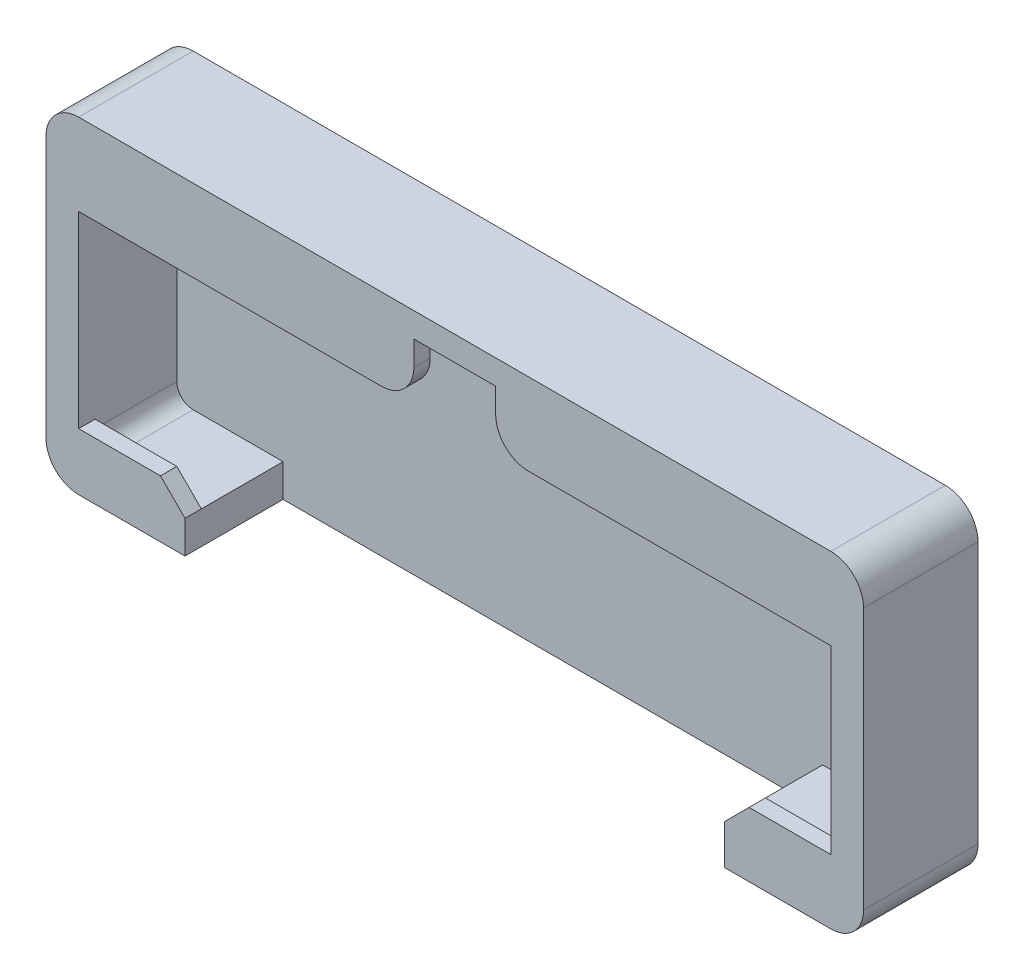
ISO-10303-21;
HEADER;
FILE_DESCRIPTION(('STEP AP214'),'2;1');
FILE_NAME('part.step','',(''),(''),'','','');
FILE_SCHEMA(('AUTOMOTIVE_DESIGN { 1 0 10303 214 1 1 1 1 }'));
ENDSEC;
DATA;
#1=APPLICATION_CONTEXT('core data for automotive mechanical design processes');
#2=APPLICATION_PROTOCOL_DEFINITION('international standard','automotive_design',2000,#1);
#3=PRODUCT_CONTEXT('',#1,'mechanical');
#4=PRODUCT('Part','Part','',(#3));
#5=PRODUCT_RELATED_PRODUCT_CATEGORY('part','',(#4));
#6=PRODUCT_DEFINITION_FORMATION('','',#4);
#7=PRODUCT_DEFINITION_CONTEXT('part definition',#1,'design');
#8=PRODUCT_DEFINITION('design','',#6,#7);
#9=PRODUCT_DEFINITION_SHAPE('','',#8);
#10=(LENGTH_UNIT() NAMED_UNIT(*) SI_UNIT(.MILLI.,.METRE.));
#11=(NAMED_UNIT(*) PLANE_ANGLE_UNIT() SI_UNIT($,.RADIAN.));
#12=(NAMED_UNIT(*) SI_UNIT($,.STERADIAN.) SOLID_ANGLE_UNIT());
#13=UNCERTAINTY_MEASURE_WITH_UNIT(LENGTH_MEASURE(1.E-05),#10,'distance_accuracy_value','');
#14=(GEOMETRIC_REPRESENTATION_CONTEXT(3) GLOBAL_UNCERTAINTY_ASSIGNED_CONTEXT((#13)) GLOBAL_UNIT_ASSIGNED_CONTEXT((#10,
#11,#12)) REPRESENTATION_CONTEXT('',''));
#15=CARTESIAN_POINT('',(0.,0.,0.));
#16=DIRECTION('',(0.,0.,1.));
#17=DIRECTION('',(1.,0.,0.));
#18=AXIS2_PLACEMENT_3D('',#15,#16,#17);
#19=CARTESIAN_POINT('',(0.,5.,0.));
#20=DIRECTION('',(0.,-1.,0.));
#21=DIRECTION('',(0.,0.,-1.));
#22=AXIS2_PLACEMENT_3D('',#19,#20,#21);
#23=PLANE('',#22);
#24=DIRECTION('',(-1.,0.,0.));
#25=VECTOR('',#24,1.);
#26=CARTESIAN_POINT('',(-23.,5.,7.));
#27=LINE('',#26,#25);
#28=CARTESIAN_POINT('',(23.,5.,7.));
#29=VERTEX_POINT('',#28);
#30=CARTESIAN_POINT('',(4.5,5.,7.));
#31=VERTEX_POINT('',#30);
#32=EDGE_CURVE('E339',#29,#31,#27,.T.);
#33=ORIENTED_EDGE('',*,*,#32,.T.);
#34=DIRECTION('',(0.,0.,1.));
#35=VECTOR('',#34,1.);
#36=CARTESIAN_POINT('',(4.5,5.,6.));
#37=LINE('',#36,#35);
#38=CARTESIAN_POINT('',(4.5,5.,6.));
#39=VERTEX_POINT('',#38);
#40=EDGE_CURVE('E11',#31,#39,#37,.F.);
#41=ORIENTED_EDGE('',*,*,#40,.T.);
#42=DIRECTION('',(1.,0.,0.));
#43=VECTOR('',#42,1.);
#44=CARTESIAN_POINT('',(-23.,5.,6.));
#45=LINE('',#44,#43);
#46=CARTESIAN_POINT('',(23.,5.,6.));
#47=VERTEX_POINT('',#46);
#48=EDGE_CURVE('E332',#39,#47,#45,.T.);
#49=ORIENTED_EDGE('',*,*,#48,.T.);
#50=DIRECTION('',(0.,0.,1.));
#51=VECTOR('',#50,1.);
#52=CARTESIAN_POINT('',(23.,5.,7.));
#53=LINE('',#52,#51);
#54=EDGE_CURVE('E336',#47,#29,#53,.T.);
#55=ORIENTED_EDGE('',*,*,#54,.T.);
#56=EDGE_LOOP('',(#33,#41,#49,#55));
#57=FACE_BOUND('',#56,.T.);
#58=ADVANCED_FACE('F33',(#57),#23,.T.);
#59=CARTESIAN_POINT('',(23.,9.,7.));
#60=DIRECTION('',(1.,0.,0.));
#61=DIRECTION('',(0.,0.,-1.));
#62=AXIS2_PLACEMENT_3D('',#59,#60,#61);
#63=PLANE('',#62);
#64=DIRECTION('',(0.,-1.,0.));
#65=VECTOR('',#64,1.);
#66=CARTESIAN_POINT('',(23.,9.,1.));
#67=LINE('',#66,#65);
#68=CARTESIAN_POINT('',(23.,8.,1.));
#69=VERTEX_POINT('',#68);
#70=CARTESIAN_POINT('',(23.,-6.56117908520792,1.));
#71=VERTEX_POINT('',#70);
#72=EDGE_CURVE('E354',#69,#71,#67,.T.);
#73=ORIENTED_EDGE('',*,*,#72,.T.);
#74=DIRECTION('',(0.,0.,-1.));
#75=VECTOR('',#74,1.);
#76=CARTESIAN_POINT('',(23.,-6.56117908520793,6.));
#77=LINE('',#76,#75);
#78=CARTESIAN_POINT('',(23.,-6.56117908520793,6.));
#79=VERTEX_POINT('',#78);
#80=EDGE_CURVE('E471',#71,#79,#77,.F.);
#81=ORIENTED_EDGE('',*,*,#80,.T.);
#82=DIRECTION('',(0.,-1.,0.));
#83=VECTOR('',#82,1.);
#84=CARTESIAN_POINT('',(23.,-6.06117908520793,6.));
#85=LINE('',#84,#83);
#86=CARTESIAN_POINT('',(23.,-6.06117908520793,6.));
#87=VERTEX_POINT('',#86);
#88=EDGE_CURVE('E286',#87,#79,#85,.T.);
#89=ORIENTED_EDGE('',*,*,#88,.F.);
#90=DIRECTION('',(0.,0.,-1.));
#91=VECTOR('',#90,1.);
#92=CARTESIAN_POINT('',(23.,-6.06117908520793,7.));
#93=LINE('',#92,#91);
#94=CARTESIAN_POINT('',(23.,-6.06117908520793,7.));
#95=VERTEX_POINT('',#94);
#96=EDGE_CURVE('E281',#95,#87,#93,.T.);
#97=ORIENTED_EDGE('',*,*,#96,.F.);
#98=DIRECTION('',(0.,-1.,0.));
#99=VECTOR('',#98,1.);
#100=CARTESIAN_POINT('',(23.,9.,7.));
#101=LINE('',#100,#99);
#102=EDGE_CURVE('E359',#29,#95,#101,.T.);
#103=ORIENTED_EDGE('',*,*,#102,.F.);
#104=ORIENTED_EDGE('',*,*,#54,.F.);
#105=DIRECTION('',(0.,1.,0.));
#106=VECTOR('',#105,1.);
#107=CARTESIAN_POINT('',(23.,5.,6.));
#108=LINE('',#107,#106);
#109=CARTESIAN_POINT('',(23.,8.,6.));
#110=VERTEX_POINT('',#109);
#111=EDGE_CURVE('E341',#47,#110,#108,.T.);
#112=ORIENTED_EDGE('',*,*,#111,.T.);
#113=DIRECTION('',(0.,0.,-1.));
#114=VECTOR('',#113,1.);
#115=CARTESIAN_POINT('',(23.,8.,1.));
#116=LINE('',#115,#114);
#117=EDGE_CURVE('E468',#110,#69,#116,.T.);
#118=ORIENTED_EDGE('',*,*,#117,.T.);
#119=EDGE_LOOP('',(#73,#81,#89,#97,#103,#104,#112,#118));
#120=FACE_BOUND('',#119,.T.);
#121=ADVANCED_FACE('F531',(#120),#63,.F.);
#122=CARTESIAN_POINT('',(23.,-7.56117908520793,7.));
#123=DIRECTION('',(0.,-1.,0.));
#124=DIRECTION('',(1.,0.,0.));
#125=AXIS2_PLACEMENT_3D('',#122,#123,#124);
#126=PLANE('',#125);
#127=DIRECTION('',(-1.,0.,0.));
#128=VECTOR('',#127,1.);
#129=CARTESIAN_POINT('',(16.5,-7.56117908520793,6.));
#130=LINE('',#129,#128);
#131=CARTESIAN_POINT('',(22.,-7.56117908520793,6.));
#132=VERTEX_POINT('',#131);
#133=CARTESIAN_POINT('',(16.5,-7.56117908520793,6.));
#134=VERTEX_POINT('',#133);
#135=EDGE_CURVE('E278',#132,#134,#130,.T.);
#136=ORIENTED_EDGE('',*,*,#135,.F.);
#137=DIRECTION('',(0.,0.,-1.));
#138=VECTOR('',#137,1.);
#139=CARTESIAN_POINT('',(22.,-7.56117908520793,1.));
#140=LINE('',#139,#138);
#141=CARTESIAN_POINT('',(22.,-7.56117908520793,1.));
#142=VERTEX_POINT('',#141);
#143=EDGE_CURVE('E465',#132,#142,#140,.T.);
#144=ORIENTED_EDGE('',*,*,#143,.T.);
#145=DIRECTION('',(-1.,0.,0.));
#146=VECTOR('',#145,1.);
#147=CARTESIAN_POINT('',(23.,-7.56117908520793,1.));
#148=LINE('',#147,#146);
#149=CARTESIAN_POINT('',(16.5,-7.56117908520793,1.));
#150=VERTEX_POINT('',#149);
#151=EDGE_CURVE('E303',#142,#150,#148,.T.);
#152=ORIENTED_EDGE('',*,*,#151,.T.);
#153=DIRECTION('',(0.,0.,-1.));
#154=VECTOR('',#153,1.);
#155=CARTESIAN_POINT('',(16.5,-7.56117908520793,7.));
#156=LINE('',#155,#154);
#157=EDGE_CURVE('E312',#134,#150,#156,.T.);
#158=ORIENTED_EDGE('',*,*,#157,.F.);
#159=EDGE_LOOP('',(#136,#144,#152,#158));
#160=FACE_BOUND('',#159,.T.);
#161=ADVANCED_FACE('F625',(#160),#126,.F.);
#162=CARTESIAN_POINT('',(-23.,9.,7.));
#163=DIRECTION('',(-1.,0.,0.));
#164=DIRECTION('',(0.,0.,1.));
#165=AXIS2_PLACEMENT_3D('',#162,#163,#164);
#166=PLANE('',#165);
#167=DIRECTION('',(0.,-1.,0.));
#168=VECTOR('',#167,1.);
#169=CARTESIAN_POINT('',(-23.,-6.5,6.));
#170=LINE('',#169,#168);
#171=CARTESIAN_POINT('',(-23.,-6.5,6.));
#172=VERTEX_POINT('',#171);
#173=CARTESIAN_POINT('',(-23.,-7.,6.));
#174=VERTEX_POINT('',#173);
#175=EDGE_CURVE('E298',#172,#174,#170,.T.);
#176=ORIENTED_EDGE('',*,*,#175,.T.);
#177=DIRECTION('',(0.,0.,-1.));
#178=VECTOR('',#177,1.);
#179=CARTESIAN_POINT('',(-23.,-7.,1.));
#180=LINE('',#179,#178);
#181=CARTESIAN_POINT('',(-23.,-7.,1.));
#182=VERTEX_POINT('',#181);
#183=EDGE_CURVE('E450',#174,#182,#180,.T.);
#184=ORIENTED_EDGE('',*,*,#183,.T.);
#185=DIRECTION('',(0.,1.,0.));
#186=VECTOR('',#185,1.);
#187=CARTESIAN_POINT('',(-23.,9.,1.));
#188=LINE('',#187,#186);
#189=CARTESIAN_POINT('',(-23.,8.,1.));
#190=VERTEX_POINT('',#189);
#191=EDGE_CURVE('E349',#182,#190,#188,.T.);
#192=ORIENTED_EDGE('',*,*,#191,.T.);
#193=DIRECTION('',(0.,0.,-1.));
#194=VECTOR('',#193,1.);
#195=CARTESIAN_POINT('',(-23.,8.,6.));
#196=LINE('',#195,#194);
#197=CARTESIAN_POINT('',(-23.,8.,6.));
#198=VERTEX_POINT('',#197);
#199=EDGE_CURVE('E448',#190,#198,#196,.F.);
#200=ORIENTED_EDGE('',*,*,#199,.T.);
#201=DIRECTION('',(0.,1.,0.));
#202=VECTOR('',#201,1.);
#203=CARTESIAN_POINT('',(-23.,5.,6.));
#204=LINE('',#203,#202);
#205=CARTESIAN_POINT('',(-23.,5.,6.));
#206=VERTEX_POINT('',#205);
#207=EDGE_CURVE('E346',#206,#198,#204,.T.);
#208=ORIENTED_EDGE('',*,*,#207,.F.);
#209=DIRECTION('',(0.,0.,-1.));
#210=VECTOR('',#209,1.);
#211=CARTESIAN_POINT('',(-23.,5.,7.));
#212=LINE('',#211,#210);
#213=CARTESIAN_POINT('',(-23.,5.,7.));
#214=VERTEX_POINT('',#213);
#215=EDGE_CURVE('E329',#214,#206,#212,.T.);
#216=ORIENTED_EDGE('',*,*,#215,.F.);
#217=DIRECTION('',(0.,1.,0.));
#218=VECTOR('',#217,1.);
#219=CARTESIAN_POINT('',(-23.,9.,7.));
#220=LINE('',#219,#218);
#221=CARTESIAN_POINT('',(-23.,-6.5,7.));
#222=VERTEX_POINT('',#221);
#223=EDGE_CURVE('E356',#222,#214,#220,.T.);
#224=ORIENTED_EDGE('',*,*,#223,.F.);
#225=DIRECTION('',(0.,0.,1.));
#226=VECTOR('',#225,1.);
#227=CARTESIAN_POINT('',(-23.,-6.5,7.));
#228=LINE('',#227,#226);
#229=EDGE_CURVE('E293',#172,#222,#228,.T.);
#230=ORIENTED_EDGE('',*,*,#229,.F.);
#231=EDGE_LOOP('',(#176,#184,#192,#200,#208,#216,#224,#230));
#232=FACE_BOUND('',#231,.T.);
#233=ADVANCED_FACE('F511',(#232),#166,.F.);
#234=CARTESIAN_POINT('',(-23.,-8.,7.));
#235=DIRECTION('',(0.,-1.,0.));
#236=DIRECTION('',(0.,0.,-1.));
#237=AXIS2_PLACEMENT_3D('',#234,#235,#236);
#238=PLANE('',#237);
#239=DIRECTION('',(-1.,0.,0.));
#240=VECTOR('',#239,1.);
#241=CARTESIAN_POINT('',(-23.,-8.,1.));
#242=LINE('',#241,#240);
#243=CARTESIAN_POINT('',(-16.5,-8.,1.));
#244=VERTEX_POINT('',#243);
#245=CARTESIAN_POINT('',(-22.,-8.,1.));
#246=VERTEX_POINT('',#245);
#247=EDGE_CURVE('E320',#244,#246,#242,.T.);
#248=ORIENTED_EDGE('',*,*,#247,.T.);
#249=DIRECTION('',(0.,0.,-1.));
#250=VECTOR('',#249,1.);
#251=CARTESIAN_POINT('',(-22.,-8.,6.));
#252=LINE('',#251,#250);
#253=CARTESIAN_POINT('',(-22.,-8.,6.));
#254=VERTEX_POINT('',#253);
#255=EDGE_CURVE('E461',#246,#254,#252,.F.);
#256=ORIENTED_EDGE('',*,*,#255,.T.);
#257=DIRECTION('',(-1.,0.,0.));
#258=VECTOR('',#257,1.);
#259=CARTESIAN_POINT('',(-16.5,-8.,6.));
#260=LINE('',#259,#258);
#261=CARTESIAN_POINT('',(-16.5,-8.,6.));
#262=VERTEX_POINT('',#261);
#263=EDGE_CURVE('E290',#262,#254,#260,.T.);
#264=ORIENTED_EDGE('',*,*,#263,.F.);
#265=DIRECTION('',(0.,0.,-1.));
#266=VECTOR('',#265,1.);
#267=CARTESIAN_POINT('',(-16.5,-8.,7.));
#268=LINE('',#267,#266);
#269=EDGE_CURVE('E319',#262,#244,#268,.T.);
#270=ORIENTED_EDGE('',*,*,#269,.T.);
#271=EDGE_LOOP('',(#248,#256,#264,#270));
#272=FACE_BOUND('',#271,.T.);
#273=ADVANCED_FACE('F643',(#272),#238,.F.);
#274=CARTESIAN_POINT('',(0.,0.,1.));
#275=DIRECTION('',(0.,0.,1.));
#276=DIRECTION('',(1.,0.,0.));
#277=AXIS2_PLACEMENT_3D('',#274,#275,#276);
#278=PLANE('',#277);
#279=ORIENTED_EDGE('',*,*,#191,.F.);
#280=CARTESIAN_POINT('',(-22.,-7.,1.));
#281=DIRECTION('',(0.,0.,1.));
#282=DIRECTION('',(1.,0.,0.));
#283=AXIS2_PLACEMENT_3D('',#280,#281,#282);
#284=CIRCLE('',#283,1.);
#285=EDGE_CURVE('E459',#182,#246,#284,.T.);
#286=ORIENTED_EDGE('',*,*,#285,.T.);
#287=ORIENTED_EDGE('',*,*,#247,.F.);
#288=DIRECTION('',(0.,1.,0.));
#289=VECTOR('',#288,1.);
#290=CARTESIAN_POINT('',(-16.5,-10.,1.));
#291=LINE('',#290,#289);
#292=CARTESIAN_POINT('',(-16.5,-10.,1.));
#293=VERTEX_POINT('',#292);
#294=EDGE_CURVE('E315',#293,#244,#291,.T.);
#295=ORIENTED_EDGE('',*,*,#294,.F.);
#296=DIRECTION('',(1.,0.,0.));
#297=VECTOR('',#296,1.);
#298=CARTESIAN_POINT('',(-25.,-10.,1.));
#299=LINE('',#298,#297);
#300=CARTESIAN_POINT('',(16.5,-10.,1.));
#301=VERTEX_POINT('',#300);
#302=EDGE_CURVE('E379',#293,#301,#299,.T.);
#303=ORIENTED_EDGE('',*,*,#302,.T.);
#304=DIRECTION('',(0.,-1.,0.));
#305=VECTOR('',#304,1.);
#306=CARTESIAN_POINT('',(16.5,-10.,1.));
#307=LINE('',#306,#305);
#308=EDGE_CURVE('E307',#150,#301,#307,.T.);
#309=ORIENTED_EDGE('',*,*,#308,.F.);
#310=ORIENTED_EDGE('',*,*,#151,.F.);
#311=CARTESIAN_POINT('',(22.,-6.56117908520793,1.));
#312=DIRECTION('',(0.,0.,1.));
#313=DIRECTION('',(1.,0.,0.));
#314=AXIS2_PLACEMENT_3D('',#311,#312,#313);
#315=CIRCLE('',#314,1.);
#316=EDGE_CURVE('E457',#142,#71,#315,.T.);
#317=ORIENTED_EDGE('',*,*,#316,.T.);
#318=ORIENTED_EDGE('',*,*,#72,.F.);
#319=CARTESIAN_POINT('',(22.,8.,1.));
#320=DIRECTION('',(0.,0.,1.));
#321=DIRECTION('',(1.,0.,0.));
#322=AXIS2_PLACEMENT_3D('',#319,#320,#321);
#323=CIRCLE('',#322,1.);
#324=CARTESIAN_POINT('',(22.,9.,1.));
#325=VERTEX_POINT('',#324);
#326=EDGE_CURVE('E455',#69,#325,#323,.T.);
#327=ORIENTED_EDGE('',*,*,#326,.T.);
#328=DIRECTION('',(1.,0.,0.));
#329=VECTOR('',#328,1.);
#330=CARTESIAN_POINT('',(-23.,9.,1.));
#331=LINE('',#330,#329);
#332=CARTESIAN_POINT('',(-22.,9.,1.));
#333=VERTEX_POINT('',#332);
#334=EDGE_CURVE('E374',#333,#325,#331,.T.);
#335=ORIENTED_EDGE('',*,*,#334,.F.);
#336=CARTESIAN_POINT('',(-22.,8.,1.));
#337=DIRECTION('',(0.,0.,1.));
#338=DIRECTION('',(1.,0.,0.));
#339=AXIS2_PLACEMENT_3D('',#336,#337,#338);
#340=CIRCLE('',#339,1.);
#341=EDGE_CURVE('E453',#333,#190,#340,.T.);
#342=ORIENTED_EDGE('',*,*,#341,.T.);
#343=EDGE_LOOP('',(#279,#286,#287,#295,#303,#309,#310,#317,#318,#327,#335,#342));
#344=FACE_BOUND('',#343,.T.);
#345=ADVANCED_FACE('F524',(#344),#278,.T.);
#346=CARTESIAN_POINT('',(-23.,9.,7.));
#347=DIRECTION('',(0.,1.,0.));
#348=DIRECTION('',(0.,0.,1.));
#349=AXIS2_PLACEMENT_3D('',#346,#347,#348);
#350=PLANE('',#349);
#351=ORIENTED_EDGE('',*,*,#334,.T.);
#352=DIRECTION('',(0.,0.,-1.));
#353=VECTOR('',#352,1.);
#354=CARTESIAN_POINT('',(22.,9.,6.));
#355=LINE('',#354,#353);
#356=CARTESIAN_POINT('',(22.,9.,6.));
#357=VERTEX_POINT('',#356);
#358=EDGE_CURVE('E478',#325,#357,#355,.F.);
#359=ORIENTED_EDGE('',*,*,#358,.T.);
#360=DIRECTION('',(1.,0.,0.));
#361=VECTOR('',#360,1.);
#362=CARTESIAN_POINT('',(-23.,9.,6.));
#363=LINE('',#362,#361);
#364=CARTESIAN_POINT('',(-22.,9.,6.));
#365=VERTEX_POINT('',#364);
#366=EDGE_CURVE('E328',#365,#357,#363,.T.);
#367=ORIENTED_EDGE('',*,*,#366,.F.);
#368=DIRECTION('',(0.,0.,-1.));
#369=VECTOR('',#368,1.);
#370=CARTESIAN_POINT('',(-22.,9.,1.));
#371=LINE('',#370,#369);
#372=EDGE_CURVE('E475',#365,#333,#371,.T.);
#373=ORIENTED_EDGE('',*,*,#372,.T.);
#374=EDGE_LOOP('',(#351,#359,#367,#373));
#375=FACE_BOUND('',#374,.T.);
#376=ADVANCED_FACE('F520',(#375),#350,.F.);
#377=CARTESIAN_POINT('',(25.,10.,1.));
#378=DIRECTION('',(-1.,0.,0.));
#379=DIRECTION('',(0.,-1.,0.));
#380=AXIS2_PLACEMENT_3D('',#377,#378,#379);
#381=PLANE('',#380);
#382=DIRECTION('',(0.,1.,0.));
#383=VECTOR('',#382,1.);
#384=CARTESIAN_POINT('',(25.,9.,7.));
#385=LINE('',#384,#383);
#386=CARTESIAN_POINT('',(25.,-8.00000000000001,7.));
#387=VERTEX_POINT('',#386);
#388=CARTESIAN_POINT('',(25.,8.,7.));
#389=VERTEX_POINT('',#388);
#390=EDGE_CURVE('E365',#387,#389,#385,.T.);
#391=ORIENTED_EDGE('',*,*,#390,.F.);
#392=DIRECTION('',(0.,0.,-1.));
#393=VECTOR('',#392,1.);
#394=CARTESIAN_POINT('',(25.,-8.00000000000001,1.));
#395=LINE('',#394,#393);
#396=CARTESIAN_POINT('',(25.,-8.00000000000001,0.));
#397=VERTEX_POINT('',#396);
#398=EDGE_CURVE('E440',#387,#397,#395,.T.);
#399=ORIENTED_EDGE('',*,*,#398,.T.);
#400=DIRECTION('',(0.,1.,0.));
#401=VECTOR('',#400,1.);
#402=CARTESIAN_POINT('',(25.,10.,0.));
#403=LINE('',#402,#401);
#404=CARTESIAN_POINT('',(25.,8.,0.));
#405=VERTEX_POINT('',#404);
#406=EDGE_CURVE('E371',#397,#405,#403,.T.);
#407=ORIENTED_EDGE('',*,*,#406,.T.);
#408=DIRECTION('',(0.,0.,-1.));
#409=VECTOR('',#408,1.);
#410=CARTESIAN_POINT('',(25.,8.,1.));
#411=LINE('',#410,#409);
#412=EDGE_CURVE('E438',#405,#389,#411,.F.);
#413=ORIENTED_EDGE('',*,*,#412,.T.);
#414=EDGE_LOOP('',(#391,#399,#407,#413));
#415=FACE_BOUND('',#414,.T.);
#416=ADVANCED_FACE('F603',(#415),#381,.F.);
#417=CARTESIAN_POINT('',(-25.,10.,1.));
#418=DIRECTION('',(0.,-1.,0.));
#419=DIRECTION('',(0.,0.,-1.));
#420=AXIS2_PLACEMENT_3D('',#417,#418,#419);
#421=PLANE('',#420);
#422=DIRECTION('',(-1.,0.,0.));
#423=VECTOR('',#422,1.);
#424=CARTESIAN_POINT('',(-25.,10.,7.));
#425=LINE('',#424,#423);
#426=CARTESIAN_POINT('',(23.,10.,7.));
#427=VERTEX_POINT('',#426);
#428=CARTESIAN_POINT('',(-23.,10.,7.));
#429=VERTEX_POINT('',#428);
#430=EDGE_CURVE('E368',#427,#429,#425,.T.);
#431=ORIENTED_EDGE('',*,*,#430,.F.);
#432=DIRECTION('',(0.,0.,-1.));
#433=VECTOR('',#432,1.);
#434=CARTESIAN_POINT('',(23.,10.,1.));
#435=LINE('',#434,#433);
#436=CARTESIAN_POINT('',(23.,10.,0.));
#437=VERTEX_POINT('',#436);
#438=EDGE_CURVE('E445',#427,#437,#435,.T.);
#439=ORIENTED_EDGE('',*,*,#438,.T.);
#440=DIRECTION('',(-1.,0.,0.));
#441=VECTOR('',#440,1.);
#442=CARTESIAN_POINT('',(-25.,10.,0.));
#443=LINE('',#442,#441);
#444=CARTESIAN_POINT('',(-23.,10.,0.));
#445=VERTEX_POINT('',#444);
#446=EDGE_CURVE('E386',#437,#445,#443,.T.);
#447=ORIENTED_EDGE('',*,*,#446,.T.);
#448=DIRECTION('',(0.,0.,-1.));
#449=VECTOR('',#448,1.);
#450=CARTESIAN_POINT('',(-23.,10.,1.));
#451=LINE('',#450,#449);
#452=EDGE_CURVE('E443',#445,#429,#451,.F.);
#453=ORIENTED_EDGE('',*,*,#452,.T.);
#454=EDGE_LOOP('',(#431,#439,#447,#453));
#455=FACE_BOUND('',#454,.T.);
#456=ADVANCED_FACE('F594',(#455),#421,.F.);
#457=CARTESIAN_POINT('',(-25.,10.,1.));
#458=DIRECTION('',(1.,0.,0.));
#459=DIRECTION('',(0.,1.,0.));
#460=AXIS2_PLACEMENT_3D('',#457,#458,#459);
#461=PLANE('',#460);
#462=DIRECTION('',(0.,-1.,0.));
#463=VECTOR('',#462,1.);
#464=CARTESIAN_POINT('',(-25.,10.,0.));
#465=LINE('',#464,#463);
#466=CARTESIAN_POINT('',(-25.,8.,0.));
#467=VERTEX_POINT('',#466);
#468=CARTESIAN_POINT('',(-25.,-8.00000000000001,0.));
#469=VERTEX_POINT('',#468);
#470=EDGE_CURVE('E389',#467,#469,#465,.T.);
#471=ORIENTED_EDGE('',*,*,#470,.T.);
#472=DIRECTION('',(0.,0.,-1.));
#473=VECTOR('',#472,1.);
#474=CARTESIAN_POINT('',(-25.,-8.00000000000001,1.));
#475=LINE('',#474,#473);
#476=CARTESIAN_POINT('',(-25.,-8.00000000000001,7.));
#477=VERTEX_POINT('',#476);
#478=EDGE_CURVE('E428',#469,#477,#475,.F.);
#479=ORIENTED_EDGE('',*,*,#478,.T.);
#480=DIRECTION('',(0.,-1.,0.));
#481=VECTOR('',#480,1.);
#482=CARTESIAN_POINT('',(-25.,10.,7.));
#483=LINE('',#482,#481);
#484=CARTESIAN_POINT('',(-25.,8.,7.));
#485=VERTEX_POINT('',#484);
#486=EDGE_CURVE('E350',#485,#477,#483,.T.);
#487=ORIENTED_EDGE('',*,*,#486,.F.);
#488=DIRECTION('',(0.,0.,-1.));
#489=VECTOR('',#488,1.);
#490=CARTESIAN_POINT('',(-25.,8.,1.));
#491=LINE('',#490,#489);
#492=EDGE_CURVE('E425',#485,#467,#491,.T.);
#493=ORIENTED_EDGE('',*,*,#492,.T.);
#494=EDGE_LOOP('',(#471,#479,#487,#493));
#495=FACE_BOUND('',#494,.T.);
#496=ADVANCED_FACE('F584',(#495),#461,.F.);
#497=CARTESIAN_POINT('',(-25.,-10.,1.));
#498=DIRECTION('',(0.,1.,0.));
#499=DIRECTION('',(0.,0.,1.));
#500=AXIS2_PLACEMENT_3D('',#497,#498,#499);
#501=PLANE('',#500);
#502=DIRECTION('',(1.,0.,0.));
#503=VECTOR('',#502,1.);
#504=CARTESIAN_POINT('',(-25.,-10.,7.));
#505=LINE('',#504,#503);
#506=CARTESIAN_POINT('',(-23.,-10.,7.));
#507=VERTEX_POINT('',#506);
#508=CARTESIAN_POINT('',(-16.5,-10.,7.));
#509=VERTEX_POINT('',#508);
#510=EDGE_CURVE('E353',#507,#509,#505,.T.);
#511=ORIENTED_EDGE('',*,*,#510,.F.);
#512=DIRECTION('',(0.,0.,-1.));
#513=VECTOR('',#512,1.);
#514=CARTESIAN_POINT('',(-23.,-10.,1.));
#515=LINE('',#514,#513);
#516=CARTESIAN_POINT('',(-23.,-10.,0.));
#517=VERTEX_POINT('',#516);
#518=EDGE_CURVE('E414',#507,#517,#515,.T.);
#519=ORIENTED_EDGE('',*,*,#518,.T.);
#520=DIRECTION('',(1.,0.,0.));
#521=VECTOR('',#520,1.);
#522=CARTESIAN_POINT('',(-25.,-10.,0.));
#523=LINE('',#522,#521);
#524=CARTESIAN_POINT('',(23.,-10.,0.));
#525=VERTEX_POINT('',#524);
#526=EDGE_CURVE('E383',#517,#525,#523,.T.);
#527=ORIENTED_EDGE('',*,*,#526,.T.);
#528=DIRECTION('',(0.,0.,-1.));
#529=VECTOR('',#528,1.);
#530=CARTESIAN_POINT('',(23.,-10.,1.));
#531=LINE('',#530,#529);
#532=CARTESIAN_POINT('',(23.,-10.,7.));
#533=VERTEX_POINT('',#532);
#534=EDGE_CURVE('E412',#525,#533,#531,.F.);
#535=ORIENTED_EDGE('',*,*,#534,.T.);
#536=DIRECTION('',(1.,0.,0.));
#537=VECTOR('',#536,1.);
#538=CARTESIAN_POINT('',(25.,-10.,7.));
#539=LINE('',#538,#537);
#540=CARTESIAN_POINT('',(16.5,-10.,7.));
#541=VERTEX_POINT('',#540);
#542=EDGE_CURVE('E362',#541,#533,#539,.T.);
#543=ORIENTED_EDGE('',*,*,#542,.F.);
#544=DIRECTION('',(0.,0.,-1.));
#545=VECTOR('',#544,1.);
#546=CARTESIAN_POINT('',(16.5,-10.,7.));
#547=LINE('',#546,#545);
#548=EDGE_CURVE('E306',#541,#301,#547,.T.);
#549=ORIENTED_EDGE('',*,*,#548,.T.);
#550=ORIENTED_EDGE('',*,*,#302,.F.);
#551=DIRECTION('',(0.,0.,-1.));
#552=VECTOR('',#551,1.);
#553=CARTESIAN_POINT('',(-16.5,-10.,7.));
#554=LINE('',#553,#552);
#555=EDGE_CURVE('E326',#509,#293,#554,.T.);
#556=ORIENTED_EDGE('',*,*,#555,.F.);
#557=EDGE_LOOP('',(#511,#519,#527,#535,#543,#549,#550,#556));
#558=FACE_BOUND('',#557,.T.);
#559=ADVANCED_FACE('F564',(#558),#501,.F.);
#560=CARTESIAN_POINT('',(0.,0.,0.));
#561=DIRECTION('',(0.,0.,1.));
#562=DIRECTION('',(1.,0.,0.));
#563=AXIS2_PLACEMENT_3D('',#560,#561,#562);
#564=PLANE('',#563);
#565=ORIENTED_EDGE('',*,*,#526,.F.);
#566=CARTESIAN_POINT('',(-23.,-8.,0.));
#567=DIRECTION('',(0.,0.,1.));
#568=DIRECTION('',(1.,0.,0.));
#569=AXIS2_PLACEMENT_3D('',#566,#567,#568);
#570=CIRCLE('',#569,2.);
#571=EDGE_CURVE('E423',#517,#469,#570,.F.);
#572=ORIENTED_EDGE('',*,*,#571,.T.);
#573=ORIENTED_EDGE('',*,*,#470,.F.);
#574=CARTESIAN_POINT('',(-23.,8.,0.));
#575=DIRECTION('',(0.,0.,1.));
#576=DIRECTION('',(1.,0.,0.));
#577=AXIS2_PLACEMENT_3D('',#574,#575,#576);
#578=CIRCLE('',#577,2.);
#579=EDGE_CURVE('E417',#467,#445,#578,.F.);
#580=ORIENTED_EDGE('',*,*,#579,.T.);
#581=ORIENTED_EDGE('',*,*,#446,.F.);
#582=CARTESIAN_POINT('',(23.,8.,0.));
#583=DIRECTION('',(0.,0.,1.));
#584=DIRECTION('',(1.,0.,0.));
#585=AXIS2_PLACEMENT_3D('',#582,#583,#584);
#586=CIRCLE('',#585,2.);
#587=EDGE_CURVE('E419',#437,#405,#586,.F.);
#588=ORIENTED_EDGE('',*,*,#587,.T.);
#589=ORIENTED_EDGE('',*,*,#406,.F.);
#590=CARTESIAN_POINT('',(23.,-8.00000000000001,0.));
#591=DIRECTION('',(0.,0.,1.));
#592=DIRECTION('',(1.,0.,0.));
#593=AXIS2_PLACEMENT_3D('',#590,#591,#592);
#594=CIRCLE('',#593,2.);
#595=EDGE_CURVE('E421',#397,#525,#594,.F.);
#596=ORIENTED_EDGE('',*,*,#595,.T.);
#597=EDGE_LOOP('',(#565,#572,#573,#580,#581,#588,#589,#596));
#598=FACE_BOUND('',#597,.T.);
#599=ADVANCED_FACE('F582',(#598),#564,.F.);
#600=CARTESIAN_POINT('',(0.,0.,7.));
#601=DIRECTION('',(0.,0.,1.));
#602=DIRECTION('',(1.,0.,0.));
#603=AXIS2_PLACEMENT_3D('',#600,#601,#602);
#604=PLANE('',#603);
#605=CARTESIAN_POINT('',(-4.5,5.,7.));
#606=VERTEX_POINT('',#605);
#607=EDGE_CURVE('E338',#606,#214,#27,.T.);
#608=ORIENTED_EDGE('',*,*,#607,.F.);
#609=CARTESIAN_POINT('',(-4.5,7.,7.));
#610=DIRECTION('',(0.,0.,1.));
#611=DIRECTION('',(1.,0.,0.));
#612=AXIS2_PLACEMENT_3D('',#609,#610,#611);
#613=CIRCLE('',#612,2.);
#614=CARTESIAN_POINT('',(-2.5,7.,7.));
#615=VERTEX_POINT('',#614);
#616=EDGE_CURVE('E495',#606,#615,#613,.T.);
#617=ORIENTED_EDGE('',*,*,#616,.T.);
#618=DIRECTION('',(0.,-1.,0.));
#619=VECTOR('',#618,1.);
#620=CARTESIAN_POINT('',(-2.5,8.5,7.));
#621=LINE('',#620,#619);
#622=CARTESIAN_POINT('',(-2.5,8.5,7.));
#623=VERTEX_POINT('',#622);
#624=EDGE_CURVE('E264',#623,#615,#621,.T.);
#625=ORIENTED_EDGE('',*,*,#624,.F.);
#626=DIRECTION('',(-1.,0.,0.));
#627=VECTOR('',#626,1.);
#628=CARTESIAN_POINT('',(-2.5,8.5,7.));
#629=LINE('',#628,#627);
#630=CARTESIAN_POINT('',(2.5,8.5,7.));
#631=VERTEX_POINT('',#630);
#632=EDGE_CURVE('E253',#631,#623,#629,.T.);
#633=ORIENTED_EDGE('',*,*,#632,.F.);
#634=DIRECTION('',(0.,1.,0.));
#635=VECTOR('',#634,1.);
#636=CARTESIAN_POINT('',(2.5,8.5,7.));
#637=LINE('',#636,#635);
#638=CARTESIAN_POINT('',(2.5,7.,7.));
#639=VERTEX_POINT('',#638);
#640=EDGE_CURVE('E247',#639,#631,#637,.T.);
#641=ORIENTED_EDGE('',*,*,#640,.F.);
#642=CARTESIAN_POINT('',(4.5,7.,7.));
#643=DIRECTION('',(0.,0.,1.));
#644=DIRECTION('',(1.,0.,0.));
#645=AXIS2_PLACEMENT_3D('',#642,#643,#644);
#646=CIRCLE('',#645,2.);
#647=EDGE_CURVE('E48',#639,#31,#646,.T.);
#648=ORIENTED_EDGE('',*,*,#647,.T.);
#649=ORIENTED_EDGE('',*,*,#32,.F.);
#650=ORIENTED_EDGE('',*,*,#102,.T.);
#651=DIRECTION('',(1.,0.,0.));
#652=VECTOR('',#651,1.);
#653=CARTESIAN_POINT('',(16.5,-6.06117908520793,7.));
#654=LINE('',#653,#652);
#655=CARTESIAN_POINT('',(18.,-6.06117908520793,7.));
#656=VERTEX_POINT('',#655);
#657=EDGE_CURVE('E279',#656,#95,#654,.T.);
#658=ORIENTED_EDGE('',*,*,#657,.F.);
#659=DIRECTION('',(0.707106781186546,0.707106781186549,0.));
#660=VECTOR('',#659,1.);
#661=CARTESIAN_POINT('',(12.030589542604,-12.0305895426039,7.));
#662=LINE('',#661,#660);
#663=CARTESIAN_POINT('',(16.5,-7.56117908520793,7.));
#664=VERTEX_POINT('',#663);
#665=EDGE_CURVE('E398',#656,#664,#662,.F.);
#666=ORIENTED_EDGE('',*,*,#665,.T.);
#667=DIRECTION('',(0.,-1.,0.));
#668=VECTOR('',#667,1.);
#669=CARTESIAN_POINT('',(16.5,-10.,7.));
#670=LINE('',#669,#668);
#671=EDGE_CURVE('E304',#664,#541,#670,.T.);
#672=ORIENTED_EDGE('',*,*,#671,.T.);
#673=ORIENTED_EDGE('',*,*,#542,.T.);
#674=CARTESIAN_POINT('',(23.,-8.00000000000001,7.));
#675=DIRECTION('',(0.,0.,1.));
#676=DIRECTION('',(1.,0.,0.));
#677=AXIS2_PLACEMENT_3D('',#674,#675,#676);
#678=CIRCLE('',#677,2.);
#679=EDGE_CURVE('E434',#533,#387,#678,.T.);
#680=ORIENTED_EDGE('',*,*,#679,.T.);
#681=ORIENTED_EDGE('',*,*,#390,.T.);
#682=CARTESIAN_POINT('',(23.,8.,7.));
#683=DIRECTION('',(0.,0.,1.));
#684=DIRECTION('',(1.,0.,0.));
#685=AXIS2_PLACEMENT_3D('',#682,#683,#684);
#686=CIRCLE('',#685,2.);
#687=EDGE_CURVE('E432',#389,#427,#686,.T.);
#688=ORIENTED_EDGE('',*,*,#687,.T.);
#689=ORIENTED_EDGE('',*,*,#430,.T.);
#690=CARTESIAN_POINT('',(-23.,8.,7.));
#691=DIRECTION('',(0.,0.,1.));
#692=DIRECTION('',(1.,0.,0.));
#693=AXIS2_PLACEMENT_3D('',#690,#691,#692);
#694=CIRCLE('',#693,2.);
#695=EDGE_CURVE('E430',#429,#485,#694,.T.);
#696=ORIENTED_EDGE('',*,*,#695,.T.);
#697=ORIENTED_EDGE('',*,*,#486,.T.);
#698=CARTESIAN_POINT('',(-23.,-8.,7.));
#699=DIRECTION('',(0.,0.,1.));
#700=DIRECTION('',(1.,0.,0.));
#701=AXIS2_PLACEMENT_3D('',#698,#699,#700);
#702=CIRCLE('',#701,2.);
#703=EDGE_CURVE('E436',#477,#507,#702,.T.);
#704=ORIENTED_EDGE('',*,*,#703,.T.);
#705=ORIENTED_EDGE('',*,*,#510,.T.);
#706=DIRECTION('',(0.,1.,0.));
#707=VECTOR('',#706,1.);
#708=CARTESIAN_POINT('',(-16.5,-10.,7.));
#709=LINE('',#708,#707);
#710=CARTESIAN_POINT('',(-16.5,-8.,7.));
#711=VERTEX_POINT('',#710);
#712=EDGE_CURVE('E316',#509,#711,#709,.T.);
#713=ORIENTED_EDGE('',*,*,#712,.T.);
#714=DIRECTION('',(-0.707106781186546,0.707106781186549,0.));
#715=VECTOR('',#714,1.);
#716=CARTESIAN_POINT('',(-12.25,-12.25,7.));
#717=LINE('',#716,#715);
#718=CARTESIAN_POINT('',(-18.,-6.5,7.));
#719=VERTEX_POINT('',#718);
#720=EDGE_CURVE('E396',#711,#719,#717,.T.);
#721=ORIENTED_EDGE('',*,*,#720,.T.);
#722=DIRECTION('',(1.,0.,0.));
#723=VECTOR('',#722,1.);
#724=CARTESIAN_POINT('',(-16.5,-6.5,7.));
#725=LINE('',#724,#723);
#726=EDGE_CURVE('E295',#222,#719,#725,.T.);
#727=ORIENTED_EDGE('',*,*,#726,.F.);
#728=ORIENTED_EDGE('',*,*,#223,.T.);
#729=EDGE_LOOP('',(#608,#617,#625,#633,#641,#648,#649,#650,#658,#666,#672,#673,#680,#681,#688,
#689,#696,#697,#704,#705,#713,#721,#727,#728));
#730=FACE_BOUND('',#729,.T.);
#731=ADVANCED_FACE('F267',(#730),#604,.T.);
#732=CARTESIAN_POINT('',(-23.,5.,6.));
#733=DIRECTION('',(0.,0.,1.));
#734=DIRECTION('',(1.,0.,0.));
#735=AXIS2_PLACEMENT_3D('',#732,#733,#734);
#736=PLANE('',#735);
#737=DIRECTION('',(0.,-1.,0.));
#738=VECTOR('',#737,1.);
#739=CARTESIAN_POINT('',(-2.5,5.,6.));
#740=LINE('',#739,#738);
#741=CARTESIAN_POINT('',(-2.5,8.5,6.));
#742=VERTEX_POINT('',#741);
#743=CARTESIAN_POINT('',(-2.5,7.,6.));
#744=VERTEX_POINT('',#743);
#745=EDGE_CURVE('E272',#742,#744,#740,.T.);
#746=ORIENTED_EDGE('',*,*,#745,.T.);
#747=CARTESIAN_POINT('',(-4.5,7.,6.));
#748=DIRECTION('',(0.,0.,1.));
#749=DIRECTION('',(1.,0.,0.));
#750=AXIS2_PLACEMENT_3D('',#747,#748,#749);
#751=CIRCLE('',#750,2.);
#752=CARTESIAN_POINT('',(-4.5,5.,6.));
#753=VERTEX_POINT('',#752);
#754=EDGE_CURVE('E490',#744,#753,#751,.F.);
#755=ORIENTED_EDGE('',*,*,#754,.T.);
#756=EDGE_CURVE('E333',#206,#753,#45,.T.);
#757=ORIENTED_EDGE('',*,*,#756,.F.);
#758=ORIENTED_EDGE('',*,*,#207,.T.);
#759=CARTESIAN_POINT('',(-22.,8.,6.));
#760=DIRECTION('',(0.,0.,1.));
#761=DIRECTION('',(1.,0.,0.));
#762=AXIS2_PLACEMENT_3D('',#759,#760,#761);
#763=CIRCLE('',#762,1.);
#764=EDGE_CURVE('E480',#198,#365,#763,.F.);
#765=ORIENTED_EDGE('',*,*,#764,.T.);
#766=ORIENTED_EDGE('',*,*,#366,.T.);
#767=CARTESIAN_POINT('',(22.,8.,6.));
#768=DIRECTION('',(0.,0.,1.));
#769=DIRECTION('',(1.,0.,0.));
#770=AXIS2_PLACEMENT_3D('',#767,#768,#769);
#771=CIRCLE('',#770,1.);
#772=EDGE_CURVE('E482',#357,#110,#771,.F.);
#773=ORIENTED_EDGE('',*,*,#772,.T.);
#774=ORIENTED_EDGE('',*,*,#111,.F.);
#775=ORIENTED_EDGE('',*,*,#48,.F.);
#776=CARTESIAN_POINT('',(4.5,7.,6.));
#777=DIRECTION('',(0.,0.,1.));
#778=DIRECTION('',(1.,0.,0.));
#779=AXIS2_PLACEMENT_3D('',#776,#777,#778);
#780=CIRCLE('',#779,2.);
#781=CARTESIAN_POINT('',(2.5,7.,6.));
#782=VERTEX_POINT('',#781);
#783=EDGE_CURVE('E488',#39,#782,#780,.F.);
#784=ORIENTED_EDGE('',*,*,#783,.T.);
#785=DIRECTION('',(0.,1.,0.));
#786=VECTOR('',#785,1.);
#787=CARTESIAN_POINT('',(2.5,5.,6.));
#788=LINE('',#787,#786);
#789=CARTESIAN_POINT('',(2.5,8.5,6.));
#790=VERTEX_POINT('',#789);
#791=EDGE_CURVE('E276',#782,#790,#788,.T.);
#792=ORIENTED_EDGE('',*,*,#791,.T.);
#793=DIRECTION('',(-1.,0.,0.));
#794=VECTOR('',#793,1.);
#795=CARTESIAN_POINT('',(-23.,8.5,6.));
#796=LINE('',#795,#794);
#797=EDGE_CURVE('E262',#790,#742,#796,.T.);
#798=ORIENTED_EDGE('',*,*,#797,.T.);
#799=EDGE_LOOP('',(#746,#755,#757,#758,#765,#766,#773,#774,#775,#784,#792,#798));
#800=FACE_BOUND('',#799,.T.);
#801=ADVANCED_FACE('F504',(#800),#736,.F.);
#802=ORIENTED_EDGE('',*,*,#756,.T.);
#803=DIRECTION('',(0.,0.,-1.));
#804=VECTOR('',#803,1.);
#805=CARTESIAN_POINT('',(-4.5,5.,7.));
#806=LINE('',#805,#804);
#807=EDGE_CURVE('E492',#753,#606,#806,.F.);
#808=ORIENTED_EDGE('',*,*,#807,.T.);
#809=ORIENTED_EDGE('',*,*,#607,.T.);
#810=ORIENTED_EDGE('',*,*,#215,.T.);
#811=EDGE_LOOP('',(#802,#808,#809,#810));
#812=FACE_BOUND('',#811,.T.);
#813=ADVANCED_FACE('F506',(#812),#23,.T.);
#814=CARTESIAN_POINT('',(-16.5,-10.,7.));
#815=DIRECTION('',(-1.,0.,0.));
#816=DIRECTION('',(0.,0.,1.));
#817=AXIS2_PLACEMENT_3D('',#814,#815,#816);
#818=PLANE('',#817);
#819=ORIENTED_EDGE('',*,*,#269,.F.);
#820=DIRECTION('',(0.,0.,1.));
#821=VECTOR('',#820,1.);
#822=CARTESIAN_POINT('',(-16.5,-8.,7.));
#823=LINE('',#822,#821);
#824=EDGE_CURVE('E410',#262,#711,#823,.T.);
#825=ORIENTED_EDGE('',*,*,#824,.T.);
#826=ORIENTED_EDGE('',*,*,#712,.F.);
#827=ORIENTED_EDGE('',*,*,#555,.T.);
#828=ORIENTED_EDGE('',*,*,#294,.T.);
#829=EDGE_LOOP('',(#819,#825,#826,#827,#828));
#830=FACE_BOUND('',#829,.T.);
#831=ADVANCED_FACE('F571',(#830),#818,.F.);
#832=CARTESIAN_POINT('',(16.5,-10.,7.));
#833=DIRECTION('',(1.,0.,0.));
#834=DIRECTION('',(0.,0.,-1.));
#835=AXIS2_PLACEMENT_3D('',#832,#833,#834);
#836=PLANE('',#835);
#837=ORIENTED_EDGE('',*,*,#671,.F.);
#838=DIRECTION('',(0.,0.,-1.));
#839=VECTOR('',#838,1.);
#840=CARTESIAN_POINT('',(16.5,-7.56117908520793,7.));
#841=LINE('',#840,#839);
#842=EDGE_CURVE('E400',#664,#134,#841,.T.);
#843=ORIENTED_EDGE('',*,*,#842,.T.);
#844=ORIENTED_EDGE('',*,*,#157,.T.);
#845=ORIENTED_EDGE('',*,*,#308,.T.);
#846=ORIENTED_EDGE('',*,*,#548,.F.);
#847=EDGE_LOOP('',(#837,#843,#844,#845,#846));
#848=FACE_BOUND('',#847,.T.);
#849=ADVANCED_FACE('F558',(#848),#836,.F.);
#850=CARTESIAN_POINT('',(-16.5,-6.5,6.));
#851=DIRECTION('',(0.,0.,1.));
#852=DIRECTION('',(1.,0.,0.));
#853=AXIS2_PLACEMENT_3D('',#850,#851,#852);
#854=PLANE('',#853);
#855=ORIENTED_EDGE('',*,*,#263,.T.);
#856=CARTESIAN_POINT('',(-22.,-7.,6.));
#857=DIRECTION('',(0.,0.,1.));
#858=DIRECTION('',(1.,0.,0.));
#859=AXIS2_PLACEMENT_3D('',#856,#857,#858);
#860=CIRCLE('',#859,1.);
#861=EDGE_CURVE('E463',#254,#174,#860,.F.);
#862=ORIENTED_EDGE('',*,*,#861,.T.);
#863=ORIENTED_EDGE('',*,*,#175,.F.);
#864=DIRECTION('',(-1.,0.,0.));
#865=VECTOR('',#864,1.);
#866=CARTESIAN_POINT('',(-16.5,-6.5,6.));
#867=LINE('',#866,#865);
#868=CARTESIAN_POINT('',(-18.,-6.5,6.));
#869=VERTEX_POINT('',#868);
#870=EDGE_CURVE('E291',#869,#172,#867,.T.);
#871=ORIENTED_EDGE('',*,*,#870,.F.);
#872=DIRECTION('',(0.707106781186546,-0.707106781186549,0.));
#873=VECTOR('',#872,1.);
#874=CARTESIAN_POINT('',(-18.,-6.5,6.));
#875=LINE('',#874,#873);
#876=EDGE_CURVE('E408',#869,#262,#875,.T.);
#877=ORIENTED_EDGE('',*,*,#876,.T.);
#878=EDGE_LOOP('',(#855,#862,#863,#871,#877));
#879=FACE_BOUND('',#878,.T.);
#880=ADVANCED_FACE('F678',(#879),#854,.F.);
#881=CARTESIAN_POINT('',(0.,-6.5,0.));
#882=DIRECTION('',(0.,1.,0.));
#883=DIRECTION('',(0.,0.,1.));
#884=AXIS2_PLACEMENT_3D('',#881,#882,#883);
#885=PLANE('',#884);
#886=ORIENTED_EDGE('',*,*,#726,.T.);
#887=DIRECTION('',(0.,0.,-1.));
#888=VECTOR('',#887,1.);
#889=CARTESIAN_POINT('',(-18.,-6.5,6.));
#890=LINE('',#889,#888);
#891=EDGE_CURVE('E405',#719,#869,#890,.T.);
#892=ORIENTED_EDGE('',*,*,#891,.T.);
#893=ORIENTED_EDGE('',*,*,#870,.T.);
#894=ORIENTED_EDGE('',*,*,#229,.T.);
#895=EDGE_LOOP('',(#886,#892,#893,#894));
#896=FACE_BOUND('',#895,.T.);
#897=ADVANCED_FACE('F666',(#896),#885,.T.);
#898=CARTESIAN_POINT('',(16.5,-6.06117908520793,6.));
#899=DIRECTION('',(0.,0.,1.));
#900=DIRECTION('',(1.,0.,0.));
#901=AXIS2_PLACEMENT_3D('',#898,#899,#900);
#902=PLANE('',#901);
#903=ORIENTED_EDGE('',*,*,#88,.T.);
#904=CARTESIAN_POINT('',(22.,-6.56117908520793,6.));
#905=DIRECTION('',(0.,0.,1.));
#906=DIRECTION('',(1.,0.,0.));
#907=AXIS2_PLACEMENT_3D('',#904,#905,#906);
#908=CIRCLE('',#907,1.);
#909=EDGE_CURVE('E473',#79,#132,#908,.F.);
#910=ORIENTED_EDGE('',*,*,#909,.T.);
#911=ORIENTED_EDGE('',*,*,#135,.T.);
#912=DIRECTION('',(-0.707106781186546,-0.707106781186549,0.));
#913=VECTOR('',#912,1.);
#914=CARTESIAN_POINT('',(18.,-6.06117908520793,6.));
#915=LINE('',#914,#913);
#916=CARTESIAN_POINT('',(18.,-6.06117908520793,6.));
#917=VERTEX_POINT('',#916);
#918=EDGE_CURVE('E403',#134,#917,#915,.F.);
#919=ORIENTED_EDGE('',*,*,#918,.T.);
#920=DIRECTION('',(-1.,0.,0.));
#921=VECTOR('',#920,1.);
#922=CARTESIAN_POINT('',(16.5,-6.06117908520793,6.));
#923=LINE('',#922,#921);
#924=EDGE_CURVE('E283',#87,#917,#923,.T.);
#925=ORIENTED_EDGE('',*,*,#924,.F.);
#926=EDGE_LOOP('',(#903,#910,#911,#919,#925));
#927=FACE_BOUND('',#926,.T.);
#928=ADVANCED_FACE('F547',(#927),#902,.F.);
#929=CARTESIAN_POINT('',(0.,-6.06117908520793,0.));
#930=DIRECTION('',(0.,-1.,0.));
#931=DIRECTION('',(1.,0.,0.));
#932=AXIS2_PLACEMENT_3D('',#929,#930,#931);
#933=PLANE('',#932);
#934=ORIENTED_EDGE('',*,*,#924,.T.);
#935=DIRECTION('',(0.,0.,1.));
#936=VECTOR('',#935,1.);
#937=CARTESIAN_POINT('',(18.,-6.06117908520793,0.));
#938=LINE('',#937,#936);
#939=EDGE_CURVE('E382',#917,#656,#938,.T.);
#940=ORIENTED_EDGE('',*,*,#939,.T.);
#941=ORIENTED_EDGE('',*,*,#657,.T.);
#942=ORIENTED_EDGE('',*,*,#96,.T.);
#943=EDGE_LOOP('',(#934,#940,#941,#942));
#944=FACE_BOUND('',#943,.T.);
#945=ADVANCED_FACE('F544',(#944),#933,.F.);
#946=CARTESIAN_POINT('',(18.,-6.06117908520793,0.));
#947=DIRECTION('',(0.707106781186549,-0.707106781186546,0.));
#948=DIRECTION('',(0.,0.,1.));
#949=AXIS2_PLACEMENT_3D('',#946,#947,#948);
#950=PLANE('',#949);
#951=ORIENTED_EDGE('',*,*,#918,.F.);
#952=ORIENTED_EDGE('',*,*,#842,.F.);
#953=ORIENTED_EDGE('',*,*,#665,.F.);
#954=ORIENTED_EDGE('',*,*,#939,.F.);
#955=EDGE_LOOP('',(#951,#952,#953,#954));
#956=FACE_BOUND('',#955,.T.);
#957=ADVANCED_FACE('F553',(#956),#950,.F.);
#958=CARTESIAN_POINT('',(-18.,-6.5,0.));
#959=DIRECTION('',(0.707106781186549,0.707106781186546,0.));
#960=DIRECTION('',(0.,0.,1.));
#961=AXIS2_PLACEMENT_3D('',#958,#959,#960);
#962=PLANE('',#961);
#963=ORIENTED_EDGE('',*,*,#720,.F.);
#964=ORIENTED_EDGE('',*,*,#824,.F.);
#965=ORIENTED_EDGE('',*,*,#876,.F.);
#966=ORIENTED_EDGE('',*,*,#891,.F.);
#967=EDGE_LOOP('',(#963,#964,#965,#966));
#968=FACE_BOUND('',#967,.T.);
#969=ADVANCED_FACE('F616',(#968),#962,.T.);
#970=CARTESIAN_POINT('',(-23.,-8.,1.));
#971=DIRECTION('',(0.,0.,-1.));
#972=DIRECTION('',(-1.,0.,0.));
#973=AXIS2_PLACEMENT_3D('',#970,#971,#972);
#974=CYLINDRICAL_SURFACE('',#973,2.);
#975=ORIENTED_EDGE('',*,*,#703,.F.);
#976=ORIENTED_EDGE('',*,*,#478,.F.);
#977=ORIENTED_EDGE('',*,*,#571,.F.);
#978=ORIENTED_EDGE('',*,*,#518,.F.);
#979=EDGE_LOOP('',(#975,#976,#977,#978));
#980=FACE_BOUND('',#979,.T.);
#981=ADVANCED_FACE('F578',(#980),#974,.T.);
#982=CARTESIAN_POINT('',(23.,-8.00000000000001,1.));
#983=DIRECTION('',(0.,0.,-1.));
#984=DIRECTION('',(-1.,0.,0.));
#985=AXIS2_PLACEMENT_3D('',#982,#983,#984);
#986=CYLINDRICAL_SURFACE('',#985,2.);
#987=ORIENTED_EDGE('',*,*,#679,.F.);
#988=ORIENTED_EDGE('',*,*,#534,.F.);
#989=ORIENTED_EDGE('',*,*,#595,.F.);
#990=ORIENTED_EDGE('',*,*,#398,.F.);
#991=EDGE_LOOP('',(#987,#988,#989,#990));
#992=FACE_BOUND('',#991,.T.);
#993=ADVANCED_FACE('F607',(#992),#986,.T.);
#994=CARTESIAN_POINT('',(23.,8.,1.));
#995=DIRECTION('',(0.,0.,-1.));
#996=DIRECTION('',(-1.,0.,0.));
#997=AXIS2_PLACEMENT_3D('',#994,#995,#996);
#998=CYLINDRICAL_SURFACE('',#997,2.);
#999=ORIENTED_EDGE('',*,*,#687,.F.);
#1000=ORIENTED_EDGE('',*,*,#412,.F.);
#1001=ORIENTED_EDGE('',*,*,#587,.F.);
#1002=ORIENTED_EDGE('',*,*,#438,.F.);
#1003=EDGE_LOOP('',(#999,#1000,#1001,#1002));
#1004=FACE_BOUND('',#1003,.T.);
#1005=ADVANCED_FACE('F598',(#1004),#998,.T.);
#1006=CARTESIAN_POINT('',(-23.,8.,1.));
#1007=DIRECTION('',(0.,0.,-1.));
#1008=DIRECTION('',(-1.,0.,0.));
#1009=AXIS2_PLACEMENT_3D('',#1006,#1007,#1008);
#1010=CYLINDRICAL_SURFACE('',#1009,2.);
#1011=ORIENTED_EDGE('',*,*,#695,.F.);
#1012=ORIENTED_EDGE('',*,*,#452,.F.);
#1013=ORIENTED_EDGE('',*,*,#579,.F.);
#1014=ORIENTED_EDGE('',*,*,#492,.F.);
#1015=EDGE_LOOP('',(#1011,#1012,#1013,#1014));
#1016=FACE_BOUND('',#1015,.T.);
#1017=ADVANCED_FACE('F589',(#1016),#1010,.T.);
#1018=CARTESIAN_POINT('',(-22.,-7.,7.));
#1019=DIRECTION('',(0.,0.,1.));
#1020=DIRECTION('',(1.,0.,0.));
#1021=AXIS2_PLACEMENT_3D('',#1018,#1019,#1020);
#1022=CYLINDRICAL_SURFACE('',#1021,1.);
#1023=ORIENTED_EDGE('',*,*,#861,.F.);
#1024=ORIENTED_EDGE('',*,*,#255,.F.);
#1025=ORIENTED_EDGE('',*,*,#285,.F.);
#1026=ORIENTED_EDGE('',*,*,#183,.F.);
#1027=EDGE_LOOP('',(#1023,#1024,#1025,#1026));
#1028=FACE_BOUND('',#1027,.T.);
#1029=ADVANCED_FACE('F674',(#1028),#1022,.F.);
#1030=CARTESIAN_POINT('',(22.,-6.56117908520793,7.));
#1031=DIRECTION('',(0.,0.,1.));
#1032=DIRECTION('',(1.,0.,0.));
#1033=AXIS2_PLACEMENT_3D('',#1030,#1031,#1032);
#1034=CYLINDRICAL_SURFACE('',#1033,1.);
#1035=ORIENTED_EDGE('',*,*,#909,.F.);
#1036=ORIENTED_EDGE('',*,*,#80,.F.);
#1037=ORIENTED_EDGE('',*,*,#316,.F.);
#1038=ORIENTED_EDGE('',*,*,#143,.F.);
#1039=EDGE_LOOP('',(#1035,#1036,#1037,#1038));
#1040=FACE_BOUND('',#1039,.T.);
#1041=ADVANCED_FACE('F811',(#1040),#1034,.F.);
#1042=CARTESIAN_POINT('',(22.,8.,7.));
#1043=DIRECTION('',(0.,0.,1.));
#1044=DIRECTION('',(1.,0.,0.));
#1045=AXIS2_PLACEMENT_3D('',#1042,#1043,#1044);
#1046=CYLINDRICAL_SURFACE('',#1045,1.);
#1047=ORIENTED_EDGE('',*,*,#772,.F.);
#1048=ORIENTED_EDGE('',*,*,#358,.F.);
#1049=ORIENTED_EDGE('',*,*,#326,.F.);
#1050=ORIENTED_EDGE('',*,*,#117,.F.);
#1051=EDGE_LOOP('',(#1047,#1048,#1049,#1050));
#1052=FACE_BOUND('',#1051,.T.);
#1053=ADVANCED_FACE('F529',(#1052),#1046,.F.);
#1054=CARTESIAN_POINT('',(-22.,8.,7.));
#1055=DIRECTION('',(0.,0.,1.));
#1056=DIRECTION('',(1.,0.,0.));
#1057=AXIS2_PLACEMENT_3D('',#1054,#1055,#1056);
#1058=CYLINDRICAL_SURFACE('',#1057,1.);
#1059=ORIENTED_EDGE('',*,*,#764,.F.);
#1060=ORIENTED_EDGE('',*,*,#199,.F.);
#1061=ORIENTED_EDGE('',*,*,#341,.F.);
#1062=ORIENTED_EDGE('',*,*,#372,.F.);
#1063=EDGE_LOOP('',(#1059,#1060,#1061,#1062));
#1064=FACE_BOUND('',#1063,.T.);
#1065=ADVANCED_FACE('F517',(#1064),#1058,.F.);
#1066=CARTESIAN_POINT('',(-2.5,8.5,5.));
#1067=DIRECTION('',(0.,1.,0.));
#1068=DIRECTION('',(0.,0.,1.));
#1069=AXIS2_PLACEMENT_3D('',#1066,#1067,#1068);
#1070=PLANE('',#1069);
#1071=DIRECTION('',(0.,0.,1.));
#1072=VECTOR('',#1071,1.);
#1073=CARTESIAN_POINT('',(2.5,8.5,5.));
#1074=LINE('',#1073,#1072);
#1075=EDGE_CURVE('E251',#790,#631,#1074,.T.);
#1076=ORIENTED_EDGE('',*,*,#1075,.T.);
#1077=ORIENTED_EDGE('',*,*,#632,.T.);
#1078=DIRECTION('',(0.,0.,1.));
#1079=VECTOR('',#1078,1.);
#1080=CARTESIAN_POINT('',(-2.5,8.5,5.));
#1081=LINE('',#1080,#1079);
#1082=EDGE_CURVE('E263',#742,#623,#1081,.T.);
#1083=ORIENTED_EDGE('',*,*,#1082,.F.);
#1084=ORIENTED_EDGE('',*,*,#797,.F.);
#1085=EDGE_LOOP('',(#1076,#1077,#1083,#1084));
#1086=FACE_BOUND('',#1085,.T.);
#1087=ADVANCED_FACE('F258',(#1086),#1070,.F.);
#1088=CARTESIAN_POINT('',(2.5,8.5,5.));
#1089=DIRECTION('',(1.,0.,0.));
#1090=DIRECTION('',(0.,1.,0.));
#1091=AXIS2_PLACEMENT_3D('',#1088,#1089,#1090);
#1092=PLANE('',#1091);
#1093=ORIENTED_EDGE('',*,*,#791,.F.);
#1094=DIRECTION('',(0.,0.,1.));
#1095=VECTOR('',#1094,1.);
#1096=CARTESIAN_POINT('',(2.5,7.,7.));
#1097=LINE('',#1096,#1095);
#1098=EDGE_CURVE('E41',#782,#639,#1097,.T.);
#1099=ORIENTED_EDGE('',*,*,#1098,.T.);
#1100=ORIENTED_EDGE('',*,*,#640,.T.);
#1101=ORIENTED_EDGE('',*,*,#1075,.F.);
#1102=EDGE_LOOP('',(#1093,#1099,#1100,#1101));
#1103=FACE_BOUND('',#1102,.T.);
#1104=ADVANCED_FACE('F250',(#1103),#1092,.F.);
#1105=CARTESIAN_POINT('',(-2.5,8.5,5.));
#1106=DIRECTION('',(-1.,0.,0.));
#1107=DIRECTION('',(0.,-1.,0.));
#1108=AXIS2_PLACEMENT_3D('',#1105,#1106,#1107);
#1109=PLANE('',#1108);
#1110=ORIENTED_EDGE('',*,*,#624,.T.);
#1111=DIRECTION('',(0.,0.,-1.));
#1112=VECTOR('',#1111,1.);
#1113=CARTESIAN_POINT('',(-2.5,7.,6.));
#1114=LINE('',#1113,#1112);
#1115=EDGE_CURVE('E485',#615,#744,#1114,.T.);
#1116=ORIENTED_EDGE('',*,*,#1115,.T.);
#1117=ORIENTED_EDGE('',*,*,#745,.F.);
#1118=ORIENTED_EDGE('',*,*,#1082,.T.);
#1119=EDGE_LOOP('',(#1110,#1116,#1117,#1118));
#1120=FACE_BOUND('',#1119,.T.);
#1121=ADVANCED_FACE('F501',(#1120),#1109,.F.);
#1122=CARTESIAN_POINT('',(-4.5,7.,5.));
#1123=DIRECTION('',(0.,0.,1.));
#1124=DIRECTION('',(1.,0.,0.));
#1125=AXIS2_PLACEMENT_3D('',#1122,#1123,#1124);
#1126=CYLINDRICAL_SURFACE('',#1125,2.);
#1127=ORIENTED_EDGE('',*,*,#616,.F.);
#1128=ORIENTED_EDGE('',*,*,#807,.F.);
#1129=ORIENTED_EDGE('',*,*,#754,.F.);
#1130=ORIENTED_EDGE('',*,*,#1115,.F.);
#1131=EDGE_LOOP('',(#1127,#1128,#1129,#1130));
#1132=FACE_BOUND('',#1131,.T.);
#1133=ADVANCED_FACE('F502',(#1132),#1126,.T.);
#1134=CARTESIAN_POINT('',(4.5,7.,5.));
#1135=DIRECTION('',(0.,0.,-1.));
#1136=DIRECTION('',(-1.,0.,0.));
#1137=AXIS2_PLACEMENT_3D('',#1134,#1135,#1136);
#1138=CYLINDRICAL_SURFACE('',#1137,2.);
#1139=ORIENTED_EDGE('',*,*,#783,.F.);
#1140=ORIENTED_EDGE('',*,*,#40,.F.);
#1141=ORIENTED_EDGE('',*,*,#647,.F.);
#1142=ORIENTED_EDGE('',*,*,#1098,.F.);
#1143=EDGE_LOOP('',(#1139,#1140,#1141,#1142));
#1144=FACE_BOUND('',#1143,.T.);
#1145=ADVANCED_FACE('F35',(#1144),#1138,.T.);
#1146=CLOSED_SHELL('',(#58,#121,#161,#233,#273,#345,#376,#416,#456,#496,#559,#599,#731,#801,
#813,#831,#849,#880,#897,#928,#945,#957,#969,#981,#993,#1005,#1017,#1029,#1041,#1053,#1065,
#1087,#1104,#1121,#1133,#1145));
#1147=MANIFOLD_SOLID_BREP('B2',#1146);
#1148=ADVANCED_BREP_SHAPE_REPRESENTATION('',(#18,#1147),#14);
#1149=SHAPE_DEFINITION_REPRESENTATION(#9,#1148);
ENDSEC;
END-ISO-10303-21;
